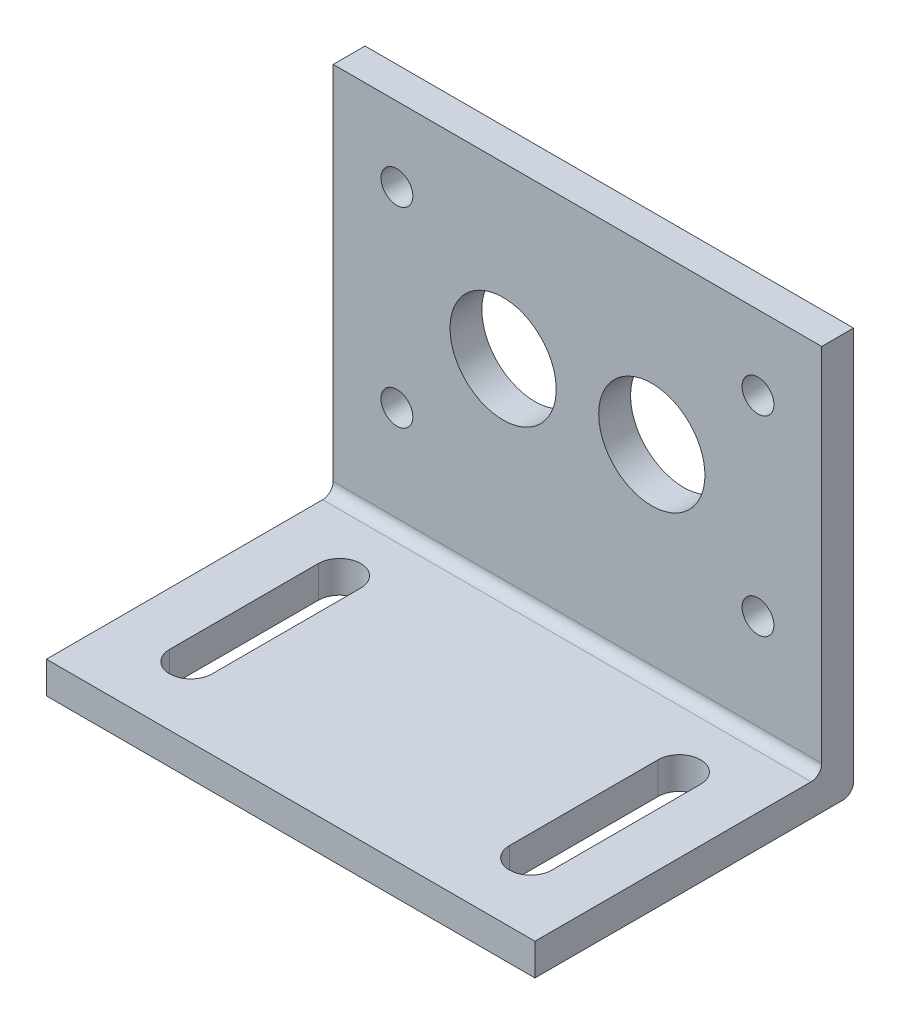
ISO-10303-21;
HEADER;
FILE_DESCRIPTION(('STEP AP214'),'2;1');
FILE_NAME('part.step','',(''),(''),'','','');
FILE_SCHEMA(('AUTOMOTIVE_DESIGN { 1 0 10303 214 1 1 1 1 }'));
ENDSEC;
DATA;
#1=APPLICATION_CONTEXT('core data for automotive mechanical design processes');
#2=APPLICATION_PROTOCOL_DEFINITION('international standard','automotive_design',2000,#1);
#3=PRODUCT_CONTEXT('',#1,'mechanical');
#4=PRODUCT('Part','Part','',(#3));
#5=PRODUCT_RELATED_PRODUCT_CATEGORY('part','',(#4));
#6=PRODUCT_DEFINITION_FORMATION('','',#4);
#7=PRODUCT_DEFINITION_CONTEXT('part definition',#1,'design');
#8=PRODUCT_DEFINITION('design','',#6,#7);
#9=PRODUCT_DEFINITION_SHAPE('','',#8);
#10=(LENGTH_UNIT() NAMED_UNIT(*) SI_UNIT(.MILLI.,.METRE.));
#11=(NAMED_UNIT(*) PLANE_ANGLE_UNIT() SI_UNIT($,.RADIAN.));
#12=(NAMED_UNIT(*) SI_UNIT($,.STERADIAN.) SOLID_ANGLE_UNIT());
#13=UNCERTAINTY_MEASURE_WITH_UNIT(LENGTH_MEASURE(1.E-05),#10,'distance_accuracy_value','');
#14=(GEOMETRIC_REPRESENTATION_CONTEXT(3) GLOBAL_UNCERTAINTY_ASSIGNED_CONTEXT((#13)) GLOBAL_UNIT_ASSIGNED_CONTEXT((#10,
#11,#12)) REPRESENTATION_CONTEXT('',''));
#15=CARTESIAN_POINT('',(0.,0.,0.));
#16=DIRECTION('',(0.,0.,1.));
#17=DIRECTION('',(1.,0.,0.));
#18=AXIS2_PLACEMENT_3D('',#15,#16,#17);
#19=CARTESIAN_POINT('',(0.,3.,0.));
#20=DIRECTION('',(0.,-1.,0.));
#21=DIRECTION('',(0.,0.,-1.));
#22=AXIS2_PLACEMENT_3D('',#19,#20,#21);
#23=PLANE('',#22);
#24=DIRECTION('',(0.,0.,-1.));
#25=VECTOR('',#24,1.);
#26=CARTESIAN_POINT('',(-14.,3.,8.4));
#27=LINE('',#26,#25);
#28=CARTESIAN_POINT('',(-14.,3.,8.4));
#29=VERTEX_POINT('',#28);
#30=CARTESIAN_POINT('',(-14.,3.,-5.6));
#31=VERTEX_POINT('',#30);
#32=EDGE_CURVE('E183',#29,#31,#27,.T.);
#33=ORIENTED_EDGE('',*,*,#32,.F.);
#34=CARTESIAN_POINT('',(-16.,3.,8.4));
#35=DIRECTION('',(0.,1.,0.));
#36=DIRECTION('',(0.,0.,1.));
#37=AXIS2_PLACEMENT_3D('',#34,#35,#36);
#38=CIRCLE('',#37,2.);
#39=CARTESIAN_POINT('',(-18.,3.,8.4));
#40=VERTEX_POINT('',#39);
#41=EDGE_CURVE('E56',#40,#29,#38,.T.);
#42=ORIENTED_EDGE('',*,*,#41,.F.);
#43=DIRECTION('',(0.,0.,1.));
#44=VECTOR('',#43,1.);
#45=CARTESIAN_POINT('',(-18.,3.,8.4));
#46=LINE('',#45,#44);
#47=CARTESIAN_POINT('',(-18.,3.,-5.6));
#48=VERTEX_POINT('',#47);
#49=EDGE_CURVE('E174',#48,#40,#46,.T.);
#50=ORIENTED_EDGE('',*,*,#49,.F.);
#51=CARTESIAN_POINT('',(-16.,3.,-5.6));
#52=DIRECTION('',(0.,1.,0.));
#53=DIRECTION('',(0.,0.,1.));
#54=AXIS2_PLACEMENT_3D('',#51,#52,#53);
#55=CIRCLE('',#54,2.);
#56=EDGE_CURVE('E177',#31,#48,#55,.T.);
#57=ORIENTED_EDGE('',*,*,#56,.F.);
#58=EDGE_LOOP('',(#33,#42,#50,#57));
#59=FACE_BOUND('',#58,.T.);
#60=DIRECTION('',(0.,0.,-1.));
#61=VECTOR('',#60,1.);
#62=CARTESIAN_POINT('',(18.,3.,8.4));
#63=LINE('',#62,#61);
#64=CARTESIAN_POINT('',(18.,3.,8.4));
#65=VERTEX_POINT('',#64);
#66=CARTESIAN_POINT('',(18.,3.,-5.6));
#67=VERTEX_POINT('',#66);
#68=EDGE_CURVE('E209',#65,#67,#63,.T.);
#69=ORIENTED_EDGE('',*,*,#68,.F.);
#70=CARTESIAN_POINT('',(16.,3.,8.4));
#71=DIRECTION('',(0.,1.,0.));
#72=DIRECTION('',(0.,0.,-1.));
#73=AXIS2_PLACEMENT_3D('',#70,#71,#72);
#74=CIRCLE('',#73,2.);
#75=CARTESIAN_POINT('',(14.,3.,8.4));
#76=VERTEX_POINT('',#75);
#77=EDGE_CURVE('E64',#76,#65,#74,.T.);
#78=ORIENTED_EDGE('',*,*,#77,.F.);
#79=DIRECTION('',(0.,0.,1.));
#80=VECTOR('',#79,1.);
#81=CARTESIAN_POINT('',(14.,3.,8.4));
#82=LINE('',#81,#80);
#83=CARTESIAN_POINT('',(14.,3.,-5.6));
#84=VERTEX_POINT('',#83);
#85=EDGE_CURVE('E202',#84,#76,#82,.T.);
#86=ORIENTED_EDGE('',*,*,#85,.F.);
#87=CARTESIAN_POINT('',(16.,3.,-5.6));
#88=DIRECTION('',(0.,1.,0.));
#89=DIRECTION('',(0.,0.,-1.));
#90=AXIS2_PLACEMENT_3D('',#87,#88,#89);
#91=CIRCLE('',#90,2.);
#92=EDGE_CURVE('E205',#67,#84,#91,.T.);
#93=ORIENTED_EDGE('',*,*,#92,.F.);
#94=EDGE_LOOP('',(#69,#78,#86,#93));
#95=FACE_BOUND('',#94,.T.);
#96=DIRECTION('',(0.,0.,-1.));
#97=VECTOR('',#96,1.);
#98=CARTESIAN_POINT('',(23.,3.,15.));
#99=LINE('',#98,#97);
#100=CARTESIAN_POINT('',(23.,3.,15.));
#101=VERTEX_POINT('',#100);
#102=CARTESIAN_POINT('',(23.,3.,-11.));
#103=VERTEX_POINT('',#102);
#104=EDGE_CURVE('E276',#101,#103,#99,.T.);
#105=ORIENTED_EDGE('',*,*,#104,.T.);
#106=DIRECTION('',(1.,0.,0.));
#107=VECTOR('',#106,1.);
#108=CARTESIAN_POINT('',(-23.,3.,-11.));
#109=LINE('',#108,#107);
#110=CARTESIAN_POINT('',(-23.,3.,-11.));
#111=VERTEX_POINT('',#110);
#112=EDGE_CURVE('E313',#103,#111,#109,.F.);
#113=ORIENTED_EDGE('',*,*,#112,.T.);
#114=DIRECTION('',(0.,0.,1.));
#115=VECTOR('',#114,1.);
#116=CARTESIAN_POINT('',(-23.,3.,15.));
#117=LINE('',#116,#115);
#118=CARTESIAN_POINT('',(-23.,3.,15.));
#119=VERTEX_POINT('',#118);
#120=EDGE_CURVE('E279',#111,#119,#117,.T.);
#121=ORIENTED_EDGE('',*,*,#120,.T.);
#122=DIRECTION('',(1.,0.,0.));
#123=VECTOR('',#122,1.);
#124=CARTESIAN_POINT('',(-23.,3.,15.));
#125=LINE('',#124,#123);
#126=EDGE_CURVE('E282',#119,#101,#125,.T.);
#127=ORIENTED_EDGE('',*,*,#126,.T.);
#128=EDGE_LOOP('',(#105,#113,#121,#127));
#129=FACE_BOUND('',#128,.T.);
#130=ADVANCED_FACE('F41',(#59,#95,#129),#23,.F.);
#131=CARTESIAN_POINT('',(23.,3.,15.));
#132=DIRECTION('',(-1.,0.,0.));
#133=DIRECTION('',(0.,0.,1.));
#134=AXIS2_PLACEMENT_3D('',#131,#132,#133);
#135=PLANE('',#134);
#136=DIRECTION('',(0.,0.,-1.));
#137=VECTOR('',#136,1.);
#138=CARTESIAN_POINT('',(23.,0.,15.));
#139=LINE('',#138,#137);
#140=CARTESIAN_POINT('',(23.,0.,15.));
#141=VERTEX_POINT('',#140);
#142=CARTESIAN_POINT('',(23.,0.,-14.));
#143=VERTEX_POINT('',#142);
#144=EDGE_CURVE('E273',#141,#143,#139,.T.);
#145=ORIENTED_EDGE('',*,*,#144,.T.);
#146=CARTESIAN_POINT('',(23.,1.,-14.));
#147=DIRECTION('',(-1.,0.,0.));
#148=DIRECTION('',(0.,0.,1.));
#149=AXIS2_PLACEMENT_3D('',#146,#147,#148);
#150=CIRCLE('',#149,1.);
#151=CARTESIAN_POINT('',(23.,1.,-15.));
#152=VERTEX_POINT('',#151);
#153=EDGE_CURVE('E308',#143,#152,#150,.F.);
#154=ORIENTED_EDGE('',*,*,#153,.T.);
#155=DIRECTION('',(0.,-1.,0.));
#156=VECTOR('',#155,1.);
#157=CARTESIAN_POINT('',(23.,3.,-15.));
#158=LINE('',#157,#156);
#159=CARTESIAN_POINT('',(23.,38.,-15.));
#160=VERTEX_POINT('',#159);
#161=EDGE_CURVE('E298',#160,#152,#158,.T.);
#162=ORIENTED_EDGE('',*,*,#161,.F.);
#163=DIRECTION('',(0.,0.,-1.));
#164=VECTOR('',#163,1.);
#165=CARTESIAN_POINT('',(23.,38.,-12.));
#166=LINE('',#165,#164);
#167=CARTESIAN_POINT('',(23.,38.,-12.));
#168=VERTEX_POINT('',#167);
#169=EDGE_CURVE('E270',#168,#160,#166,.T.);
#170=ORIENTED_EDGE('',*,*,#169,.F.);
#171=DIRECTION('',(0.,-1.,0.));
#172=VECTOR('',#171,1.);
#173=CARTESIAN_POINT('',(23.,38.,-12.));
#174=LINE('',#173,#172);
#175=CARTESIAN_POINT('',(23.,4.,-12.));
#176=VERTEX_POINT('',#175);
#177=EDGE_CURVE('E264',#168,#176,#174,.T.);
#178=ORIENTED_EDGE('',*,*,#177,.T.);
#179=CARTESIAN_POINT('',(23.,4.,-11.));
#180=DIRECTION('',(-1.,0.,0.));
#181=DIRECTION('',(0.,0.,1.));
#182=AXIS2_PLACEMENT_3D('',#179,#180,#181);
#183=CIRCLE('',#182,1.);
#184=EDGE_CURVE('E49',#176,#103,#183,.T.);
#185=ORIENTED_EDGE('',*,*,#184,.T.);
#186=ORIENTED_EDGE('',*,*,#104,.F.);
#187=DIRECTION('',(0.,-1.,0.));
#188=VECTOR('',#187,1.);
#189=CARTESIAN_POINT('',(23.,3.,15.));
#190=LINE('',#189,#188);
#191=EDGE_CURVE('E284',#101,#141,#190,.T.);
#192=ORIENTED_EDGE('',*,*,#191,.T.);
#193=EDGE_LOOP('',(#145,#154,#162,#170,#178,#185,#186,#192));
#194=FACE_BOUND('',#193,.T.);
#195=ADVANCED_FACE('F316',(#194),#135,.F.);
#196=CARTESIAN_POINT('',(-23.,3.,-15.));
#197=DIRECTION('',(0.,0.,1.));
#198=DIRECTION('',(1.,0.,0.));
#199=AXIS2_PLACEMENT_3D('',#196,#197,#198);
#200=PLANE('',#199);
#201=CARTESIAN_POINT('',(-7.,22.,-15.));
#202=DIRECTION('',(0.,0.,-1.));
#203=DIRECTION('',(-1.,0.,0.));
#204=AXIS2_PLACEMENT_3D('',#201,#202,#203);
#205=CIRCLE('',#204,5.);
#206=CARTESIAN_POINT('',(-12.,22.,-15.));
#207=VERTEX_POINT('',#206);
#208=EDGE_CURVE('E236',#207,#207,#205,.T.);
#209=ORIENTED_EDGE('',*,*,#208,.F.);
#210=EDGE_LOOP('',(#209));
#211=FACE_BOUND('',#210,.T.);
#212=CARTESIAN_POINT('',(17.,13.,-15.));
#213=DIRECTION('',(0.,0.,-1.));
#214=DIRECTION('',(-1.,0.,0.));
#215=AXIS2_PLACEMENT_3D('',#212,#213,#214);
#216=CIRCLE('',#215,1.5);
#217=CARTESIAN_POINT('',(15.5,13.,-15.));
#218=VERTEX_POINT('',#217);
#219=EDGE_CURVE('E229',#218,#218,#216,.T.);
#220=ORIENTED_EDGE('',*,*,#219,.F.);
#221=EDGE_LOOP('',(#220));
#222=FACE_BOUND('',#221,.T.);
#223=CARTESIAN_POINT('',(17.,31.,-15.));
#224=DIRECTION('',(0.,0.,-1.));
#225=DIRECTION('',(-1.,0.,0.));
#226=AXIS2_PLACEMENT_3D('',#223,#224,#225);
#227=CIRCLE('',#226,1.5);
#228=CARTESIAN_POINT('',(15.5,31.,-15.));
#229=VERTEX_POINT('',#228);
#230=EDGE_CURVE('E248',#229,#229,#227,.T.);
#231=ORIENTED_EDGE('',*,*,#230,.F.);
#232=EDGE_LOOP('',(#231));
#233=FACE_BOUND('',#232,.T.);
#234=CARTESIAN_POINT('',(-17.,13.,-15.));
#235=DIRECTION('',(0.,0.,-1.));
#236=DIRECTION('',(-1.,0.,0.));
#237=AXIS2_PLACEMENT_3D('',#234,#235,#236);
#238=CIRCLE('',#237,1.5);
#239=CARTESIAN_POINT('',(-18.5,13.,-15.));
#240=VERTEX_POINT('',#239);
#241=EDGE_CURVE('E241',#240,#240,#238,.T.);
#242=ORIENTED_EDGE('',*,*,#241,.F.);
#243=EDGE_LOOP('',(#242));
#244=FACE_BOUND('',#243,.T.);
#245=CARTESIAN_POINT('',(7.,22.,-15.));
#246=DIRECTION('',(0.,0.,-1.));
#247=DIRECTION('',(-1.,0.,0.));
#248=AXIS2_PLACEMENT_3D('',#245,#246,#247);
#249=CIRCLE('',#248,5.);
#250=CARTESIAN_POINT('',(2.,22.,-15.));
#251=VERTEX_POINT('',#250);
#252=EDGE_CURVE('E223',#251,#251,#249,.T.);
#253=ORIENTED_EDGE('',*,*,#252,.F.);
#254=EDGE_LOOP('',(#253));
#255=FACE_BOUND('',#254,.T.);
#256=CARTESIAN_POINT('',(-17.,31.,-15.));
#257=DIRECTION('',(0.,0.,-1.));
#258=DIRECTION('',(-1.,0.,0.));
#259=AXIS2_PLACEMENT_3D('',#256,#257,#258);
#260=CIRCLE('',#259,1.5);
#261=CARTESIAN_POINT('',(-18.5,31.,-15.));
#262=VERTEX_POINT('',#261);
#263=EDGE_CURVE('E244',#262,#262,#260,.T.);
#264=ORIENTED_EDGE('',*,*,#263,.F.);
#265=EDGE_LOOP('',(#264));
#266=FACE_BOUND('',#265,.T.);
#267=ORIENTED_EDGE('',*,*,#161,.T.);
#268=DIRECTION('',(-1.,0.,0.));
#269=VECTOR('',#268,1.);
#270=CARTESIAN_POINT('',(-23.,1.,-15.));
#271=LINE('',#270,#269);
#272=CARTESIAN_POINT('',(-23.,1.,-15.));
#273=VERTEX_POINT('',#272);
#274=EDGE_CURVE('E301',#152,#273,#271,.T.);
#275=ORIENTED_EDGE('',*,*,#274,.T.);
#276=DIRECTION('',(0.,-1.,0.));
#277=VECTOR('',#276,1.);
#278=CARTESIAN_POINT('',(-23.,3.,-15.));
#279=LINE('',#278,#277);
#280=CARTESIAN_POINT('',(-23.,38.,-15.));
#281=VERTEX_POINT('',#280);
#282=EDGE_CURVE('E295',#281,#273,#279,.T.);
#283=ORIENTED_EDGE('',*,*,#282,.F.);
#284=DIRECTION('',(1.,0.,0.));
#285=VECTOR('',#284,1.);
#286=CARTESIAN_POINT('',(23.,38.,-15.));
#287=LINE('',#286,#285);
#288=EDGE_CURVE('E256',#281,#160,#287,.T.);
#289=ORIENTED_EDGE('',*,*,#288,.T.);
#290=EDGE_LOOP('',(#267,#275,#283,#289));
#291=FACE_BOUND('',#290,.T.);
#292=ADVANCED_FACE('F339',(#211,#222,#233,#244,#255,#266,#291),#200,.F.);
#293=CARTESIAN_POINT('',(-23.,3.,15.));
#294=DIRECTION('',(1.,0.,0.));
#295=DIRECTION('',(0.,0.,-1.));
#296=AXIS2_PLACEMENT_3D('',#293,#294,#295);
#297=PLANE('',#296);
#298=ORIENTED_EDGE('',*,*,#282,.T.);
#299=CARTESIAN_POINT('',(-23.,1.,-14.));
#300=DIRECTION('',(1.,0.,0.));
#301=DIRECTION('',(0.,0.,-1.));
#302=AXIS2_PLACEMENT_3D('',#299,#300,#301);
#303=CIRCLE('',#302,1.);
#304=CARTESIAN_POINT('',(-23.,0.,-14.));
#305=VERTEX_POINT('',#304);
#306=EDGE_CURVE('E304',#273,#305,#303,.F.);
#307=ORIENTED_EDGE('',*,*,#306,.T.);
#308=DIRECTION('',(0.,0.,1.));
#309=VECTOR('',#308,1.);
#310=CARTESIAN_POINT('',(-23.,0.,15.));
#311=LINE('',#310,#309);
#312=CARTESIAN_POINT('',(-23.,0.,15.));
#313=VERTEX_POINT('',#312);
#314=EDGE_CURVE('E287',#305,#313,#311,.T.);
#315=ORIENTED_EDGE('',*,*,#314,.T.);
#316=DIRECTION('',(0.,-1.,0.));
#317=VECTOR('',#316,1.);
#318=CARTESIAN_POINT('',(-23.,3.,15.));
#319=LINE('',#318,#317);
#320=EDGE_CURVE('E292',#119,#313,#319,.T.);
#321=ORIENTED_EDGE('',*,*,#320,.F.);
#322=ORIENTED_EDGE('',*,*,#120,.F.);
#323=CARTESIAN_POINT('',(-23.,4.,-11.));
#324=DIRECTION('',(1.,0.,0.));
#325=DIRECTION('',(0.,0.,-1.));
#326=AXIS2_PLACEMENT_3D('',#323,#324,#325);
#327=CIRCLE('',#326,1.);
#328=CARTESIAN_POINT('',(-23.,4.,-12.));
#329=VERTEX_POINT('',#328);
#330=EDGE_CURVE('E11',#111,#329,#327,.T.);
#331=ORIENTED_EDGE('',*,*,#330,.T.);
#332=DIRECTION('',(0.,1.,0.));
#333=VECTOR('',#332,1.);
#334=CARTESIAN_POINT('',(-23.,38.,-12.));
#335=LINE('',#334,#333);
#336=CARTESIAN_POINT('',(-23.,38.,-12.));
#337=VERTEX_POINT('',#336);
#338=EDGE_CURVE('E259',#329,#337,#335,.T.);
#339=ORIENTED_EDGE('',*,*,#338,.T.);
#340=DIRECTION('',(0.,0.,-1.));
#341=VECTOR('',#340,1.);
#342=CARTESIAN_POINT('',(-23.,38.,-12.));
#343=LINE('',#342,#341);
#344=EDGE_CURVE('E267',#337,#281,#343,.T.);
#345=ORIENTED_EDGE('',*,*,#344,.T.);
#346=EDGE_LOOP('',(#298,#307,#315,#321,#322,#331,#339,#345));
#347=FACE_BOUND('',#346,.T.);
#348=ADVANCED_FACE('F328',(#347),#297,.F.);
#349=CARTESIAN_POINT('',(-23.,3.,15.));
#350=DIRECTION('',(0.,0.,-1.));
#351=DIRECTION('',(-1.,0.,0.));
#352=AXIS2_PLACEMENT_3D('',#349,#350,#351);
#353=PLANE('',#352);
#354=DIRECTION('',(1.,0.,0.));
#355=VECTOR('',#354,1.);
#356=CARTESIAN_POINT('',(-23.,0.,15.));
#357=LINE('',#356,#355);
#358=EDGE_CURVE('E280',#313,#141,#357,.T.);
#359=ORIENTED_EDGE('',*,*,#358,.T.);
#360=ORIENTED_EDGE('',*,*,#191,.F.);
#361=ORIENTED_EDGE('',*,*,#126,.F.);
#362=ORIENTED_EDGE('',*,*,#320,.T.);
#363=EDGE_LOOP('',(#359,#360,#361,#362));
#364=FACE_BOUND('',#363,.T.);
#365=ADVANCED_FACE('F349',(#364),#353,.F.);
#366=CARTESIAN_POINT('',(0.,0.,0.));
#367=DIRECTION('',(0.,-1.,0.));
#368=DIRECTION('',(0.,0.,-1.));
#369=AXIS2_PLACEMENT_3D('',#366,#367,#368);
#370=PLANE('',#369);
#371=CARTESIAN_POINT('',(-16.,0.,8.4));
#372=DIRECTION('',(0.,1.,0.));
#373=DIRECTION('',(0.,0.,1.));
#374=AXIS2_PLACEMENT_3D('',#371,#372,#373);
#375=CIRCLE('',#374,2.);
#376=CARTESIAN_POINT('',(-18.,0.,8.4));
#377=VERTEX_POINT('',#376);
#378=CARTESIAN_POINT('',(-14.,0.,8.4));
#379=VERTEX_POINT('',#378);
#380=EDGE_CURVE('E155',#377,#379,#375,.T.);
#381=ORIENTED_EDGE('',*,*,#380,.T.);
#382=DIRECTION('',(0.,0.,-1.));
#383=VECTOR('',#382,1.);
#384=CARTESIAN_POINT('',(-14.,0.,8.4));
#385=LINE('',#384,#383);
#386=CARTESIAN_POINT('',(-14.,0.,-5.6));
#387=VERTEX_POINT('',#386);
#388=EDGE_CURVE('E165',#379,#387,#385,.T.);
#389=ORIENTED_EDGE('',*,*,#388,.T.);
#390=CARTESIAN_POINT('',(-16.,0.,-5.6));
#391=DIRECTION('',(0.,1.,0.));
#392=DIRECTION('',(0.,0.,1.));
#393=AXIS2_PLACEMENT_3D('',#390,#391,#392);
#394=CIRCLE('',#393,2.);
#395=CARTESIAN_POINT('',(-18.,0.,-5.6));
#396=VERTEX_POINT('',#395);
#397=EDGE_CURVE('E169',#387,#396,#394,.T.);
#398=ORIENTED_EDGE('',*,*,#397,.T.);
#399=DIRECTION('',(0.,0.,1.));
#400=VECTOR('',#399,1.);
#401=CARTESIAN_POINT('',(-18.,0.,8.4));
#402=LINE('',#401,#400);
#403=EDGE_CURVE('E161',#396,#377,#402,.T.);
#404=ORIENTED_EDGE('',*,*,#403,.T.);
#405=EDGE_LOOP('',(#381,#389,#398,#404));
#406=FACE_BOUND('',#405,.T.);
#407=CARTESIAN_POINT('',(16.,0.,8.4));
#408=DIRECTION('',(0.,1.,0.));
#409=DIRECTION('',(0.,0.,-1.));
#410=AXIS2_PLACEMENT_3D('',#407,#408,#409);
#411=CIRCLE('',#410,2.);
#412=CARTESIAN_POINT('',(14.,0.,8.4));
#413=VERTEX_POINT('',#412);
#414=CARTESIAN_POINT('',(18.,0.,8.4));
#415=VERTEX_POINT('',#414);
#416=EDGE_CURVE('E206',#413,#415,#411,.T.);
#417=ORIENTED_EDGE('',*,*,#416,.T.);
#418=DIRECTION('',(0.,0.,-1.));
#419=VECTOR('',#418,1.);
#420=CARTESIAN_POINT('',(18.,0.,8.4));
#421=LINE('',#420,#419);
#422=CARTESIAN_POINT('',(18.,0.,-5.6));
#423=VERTEX_POINT('',#422);
#424=EDGE_CURVE('E218',#415,#423,#421,.T.);
#425=ORIENTED_EDGE('',*,*,#424,.T.);
#426=CARTESIAN_POINT('',(16.,0.,-5.6));
#427=DIRECTION('',(0.,1.,0.));
#428=DIRECTION('',(0.,0.,-1.));
#429=AXIS2_PLACEMENT_3D('',#426,#427,#428);
#430=CIRCLE('',#429,2.);
#431=CARTESIAN_POINT('',(14.,0.,-5.6));
#432=VERTEX_POINT('',#431);
#433=EDGE_CURVE('E215',#423,#432,#430,.T.);
#434=ORIENTED_EDGE('',*,*,#433,.T.);
#435=DIRECTION('',(0.,0.,1.));
#436=VECTOR('',#435,1.);
#437=CARTESIAN_POINT('',(14.,0.,8.4));
#438=LINE('',#437,#436);
#439=EDGE_CURVE('E195',#432,#413,#438,.T.);
#440=ORIENTED_EDGE('',*,*,#439,.T.);
#441=EDGE_LOOP('',(#417,#425,#434,#440));
#442=FACE_BOUND('',#441,.T.);
#443=ORIENTED_EDGE('',*,*,#314,.F.);
#444=DIRECTION('',(-1.,0.,0.));
#445=VECTOR('',#444,1.);
#446=CARTESIAN_POINT('',(23.,0.,-14.));
#447=LINE('',#446,#445);
#448=EDGE_CURVE('E306',#305,#143,#447,.F.);
#449=ORIENTED_EDGE('',*,*,#448,.T.);
#450=ORIENTED_EDGE('',*,*,#144,.F.);
#451=ORIENTED_EDGE('',*,*,#358,.F.);
#452=EDGE_LOOP('',(#443,#449,#450,#451));
#453=FACE_BOUND('',#452,.T.);
#454=ADVANCED_FACE('F171',(#406,#442,#453),#370,.T.);
#455=CARTESIAN_POINT('',(0.,0.,-12.));
#456=DIRECTION('',(0.,0.,-1.));
#457=DIRECTION('',(-1.,0.,0.));
#458=AXIS2_PLACEMENT_3D('',#455,#456,#457);
#459=PLANE('',#458);
#460=CARTESIAN_POINT('',(-7.,22.,-12.));
#461=DIRECTION('',(0.,0.,-1.));
#462=DIRECTION('',(-1.,0.,0.));
#463=AXIS2_PLACEMENT_3D('',#460,#461,#462);
#464=CIRCLE('',#463,5.);
#465=CARTESIAN_POINT('',(-12.,22.,-12.));
#466=VERTEX_POINT('',#465);
#467=EDGE_CURVE('E226',#466,#466,#464,.T.);
#468=ORIENTED_EDGE('',*,*,#467,.T.);
#469=EDGE_LOOP('',(#468));
#470=FACE_BOUND('',#469,.T.);
#471=CARTESIAN_POINT('',(17.,13.,-12.));
#472=DIRECTION('',(0.,0.,-1.));
#473=DIRECTION('',(-1.,0.,0.));
#474=AXIS2_PLACEMENT_3D('',#471,#472,#473);
#475=CIRCLE('',#474,1.5);
#476=CARTESIAN_POINT('',(15.5,13.,-12.));
#477=VERTEX_POINT('',#476);
#478=EDGE_CURVE('E233',#477,#477,#475,.T.);
#479=ORIENTED_EDGE('',*,*,#478,.T.);
#480=EDGE_LOOP('',(#479));
#481=FACE_BOUND('',#480,.T.);
#482=CARTESIAN_POINT('',(17.,31.,-12.));
#483=DIRECTION('',(0.,0.,-1.));
#484=DIRECTION('',(-1.,0.,0.));
#485=AXIS2_PLACEMENT_3D('',#482,#483,#484);
#486=CIRCLE('',#485,1.5);
#487=CARTESIAN_POINT('',(15.5,31.,-12.));
#488=VERTEX_POINT('',#487);
#489=EDGE_CURVE('E232',#488,#488,#486,.T.);
#490=ORIENTED_EDGE('',*,*,#489,.T.);
#491=EDGE_LOOP('',(#490));
#492=FACE_BOUND('',#491,.T.);
#493=CARTESIAN_POINT('',(-17.,13.,-12.));
#494=DIRECTION('',(0.,0.,-1.));
#495=DIRECTION('',(-1.,0.,0.));
#496=AXIS2_PLACEMENT_3D('',#493,#494,#495);
#497=CIRCLE('',#496,1.5);
#498=CARTESIAN_POINT('',(-18.5,13.,-12.));
#499=VERTEX_POINT('',#498);
#500=EDGE_CURVE('E245',#499,#499,#497,.T.);
#501=ORIENTED_EDGE('',*,*,#500,.T.);
#502=EDGE_LOOP('',(#501));
#503=FACE_BOUND('',#502,.T.);
#504=CARTESIAN_POINT('',(7.,22.,-12.));
#505=DIRECTION('',(0.,0.,-1.));
#506=DIRECTION('',(-1.,0.,0.));
#507=AXIS2_PLACEMENT_3D('',#504,#505,#506);
#508=CIRCLE('',#507,5.);
#509=CARTESIAN_POINT('',(2.,22.,-12.));
#510=VERTEX_POINT('',#509);
#511=EDGE_CURVE('E189',#510,#510,#508,.T.);
#512=ORIENTED_EDGE('',*,*,#511,.T.);
#513=EDGE_LOOP('',(#512));
#514=FACE_BOUND('',#513,.T.);
#515=CARTESIAN_POINT('',(-17.,31.,-12.));
#516=DIRECTION('',(0.,0.,-1.));
#517=DIRECTION('',(-1.,0.,0.));
#518=AXIS2_PLACEMENT_3D('',#515,#516,#517);
#519=CIRCLE('',#518,1.5);
#520=CARTESIAN_POINT('',(-18.5,31.,-12.));
#521=VERTEX_POINT('',#520);
#522=EDGE_CURVE('E253',#521,#521,#519,.T.);
#523=ORIENTED_EDGE('',*,*,#522,.T.);
#524=EDGE_LOOP('',(#523));
#525=FACE_BOUND('',#524,.T.);
#526=ORIENTED_EDGE('',*,*,#338,.F.);
#527=DIRECTION('',(1.,0.,0.));
#528=VECTOR('',#527,1.);
#529=CARTESIAN_POINT('',(23.,4.,-12.));
#530=LINE('',#529,#528);
#531=EDGE_CURVE('E310',#329,#176,#530,.T.);
#532=ORIENTED_EDGE('',*,*,#531,.T.);
#533=ORIENTED_EDGE('',*,*,#177,.F.);
#534=DIRECTION('',(1.,0.,0.));
#535=VECTOR('',#534,1.);
#536=CARTESIAN_POINT('',(23.,38.,-12.));
#537=LINE('',#536,#535);
#538=EDGE_CURVE('E261',#337,#168,#537,.T.);
#539=ORIENTED_EDGE('',*,*,#538,.F.);
#540=EDGE_LOOP('',(#526,#532,#533,#539));
#541=FACE_BOUND('',#540,.T.);
#542=ADVANCED_FACE('F333',(#470,#481,#492,#503,#514,#525,#541),#459,.F.);
#543=CARTESIAN_POINT('',(23.,38.,-12.));
#544=DIRECTION('',(0.,1.,0.));
#545=DIRECTION('',(0.,0.,1.));
#546=AXIS2_PLACEMENT_3D('',#543,#544,#545);
#547=PLANE('',#546);
#548=ORIENTED_EDGE('',*,*,#288,.F.);
#549=ORIENTED_EDGE('',*,*,#344,.F.);
#550=ORIENTED_EDGE('',*,*,#538,.T.);
#551=ORIENTED_EDGE('',*,*,#169,.T.);
#552=EDGE_LOOP('',(#548,#549,#550,#551));
#553=FACE_BOUND('',#552,.T.);
#554=ADVANCED_FACE('F336',(#553),#547,.T.);
#555=CARTESIAN_POINT('',(-23.,1.,-14.));
#556=DIRECTION('',(1.,0.,0.));
#557=DIRECTION('',(0.,0.,-1.));
#558=AXIS2_PLACEMENT_3D('',#555,#556,#557);
#559=CYLINDRICAL_SURFACE('',#558,1.);
#560=ORIENTED_EDGE('',*,*,#153,.F.);
#561=ORIENTED_EDGE('',*,*,#448,.F.);
#562=ORIENTED_EDGE('',*,*,#306,.F.);
#563=ORIENTED_EDGE('',*,*,#274,.F.);
#564=EDGE_LOOP('',(#560,#561,#562,#563));
#565=FACE_BOUND('',#564,.T.);
#566=ADVANCED_FACE('F343',(#565),#559,.T.);
#567=CARTESIAN_POINT('',(0.,4.,-11.));
#568=DIRECTION('',(-1.,0.,0.));
#569=DIRECTION('',(0.,0.,1.));
#570=AXIS2_PLACEMENT_3D('',#567,#568,#569);
#571=CYLINDRICAL_SURFACE('',#570,1.);
#572=ORIENTED_EDGE('',*,*,#330,.F.);
#573=ORIENTED_EDGE('',*,*,#112,.F.);
#574=ORIENTED_EDGE('',*,*,#184,.F.);
#575=ORIENTED_EDGE('',*,*,#531,.F.);
#576=EDGE_LOOP('',(#572,#573,#574,#575));
#577=FACE_BOUND('',#576,.T.);
#578=ADVANCED_FACE('F43',(#577),#571,.F.);
#579=CARTESIAN_POINT('',(-17.,31.,-12.));
#580=DIRECTION('',(0.,0.,-1.));
#581=DIRECTION('',(-1.,0.,0.));
#582=AXIS2_PLACEMENT_3D('',#579,#580,#581);
#583=CYLINDRICAL_SURFACE('',#582,1.5);
#584=ORIENTED_EDGE('',*,*,#522,.F.);
#585=EDGE_LOOP('',(#584));
#586=FACE_BOUND('',#585,.T.);
#587=ORIENTED_EDGE('',*,*,#263,.T.);
#588=EDGE_LOOP('',(#587));
#589=FACE_BOUND('',#588,.T.);
#590=ADVANCED_FACE('F373',(#586,#589),#583,.F.);
#591=CARTESIAN_POINT('',(7.,22.,-12.));
#592=DIRECTION('',(0.,0.,-1.));
#593=DIRECTION('',(-1.,0.,0.));
#594=AXIS2_PLACEMENT_3D('',#591,#592,#593);
#595=CYLINDRICAL_SURFACE('',#594,5.);
#596=ORIENTED_EDGE('',*,*,#511,.F.);
#597=EDGE_LOOP('',(#596));
#598=FACE_BOUND('',#597,.T.);
#599=ORIENTED_EDGE('',*,*,#252,.T.);
#600=EDGE_LOOP('',(#599));
#601=FACE_BOUND('',#600,.T.);
#602=ADVANCED_FACE('F376',(#598,#601),#595,.F.);
#603=CARTESIAN_POINT('',(-17.,13.,-12.));
#604=DIRECTION('',(0.,0.,-1.));
#605=DIRECTION('',(-1.,0.,0.));
#606=AXIS2_PLACEMENT_3D('',#603,#604,#605);
#607=CYLINDRICAL_SURFACE('',#606,1.5);
#608=ORIENTED_EDGE('',*,*,#500,.F.);
#609=EDGE_LOOP('',(#608));
#610=FACE_BOUND('',#609,.T.);
#611=ORIENTED_EDGE('',*,*,#241,.T.);
#612=EDGE_LOOP('',(#611));
#613=FACE_BOUND('',#612,.T.);
#614=ADVANCED_FACE('F382',(#610,#613),#607,.F.);
#615=CARTESIAN_POINT('',(17.,31.,-12.));
#616=DIRECTION('',(0.,0.,-1.));
#617=DIRECTION('',(-1.,0.,0.));
#618=AXIS2_PLACEMENT_3D('',#615,#616,#617);
#619=CYLINDRICAL_SURFACE('',#618,1.5);
#620=ORIENTED_EDGE('',*,*,#489,.F.);
#621=EDGE_LOOP('',(#620));
#622=FACE_BOUND('',#621,.T.);
#623=ORIENTED_EDGE('',*,*,#230,.T.);
#624=EDGE_LOOP('',(#623));
#625=FACE_BOUND('',#624,.T.);
#626=ADVANCED_FACE('F378',(#622,#625),#619,.F.);
#627=CARTESIAN_POINT('',(17.,13.,-12.));
#628=DIRECTION('',(0.,0.,-1.));
#629=DIRECTION('',(-1.,0.,0.));
#630=AXIS2_PLACEMENT_3D('',#627,#628,#629);
#631=CYLINDRICAL_SURFACE('',#630,1.5);
#632=ORIENTED_EDGE('',*,*,#478,.F.);
#633=EDGE_LOOP('',(#632));
#634=FACE_BOUND('',#633,.T.);
#635=ORIENTED_EDGE('',*,*,#219,.T.);
#636=EDGE_LOOP('',(#635));
#637=FACE_BOUND('',#636,.T.);
#638=ADVANCED_FACE('F381',(#634,#637),#631,.F.);
#639=CARTESIAN_POINT('',(-7.,22.,-12.));
#640=DIRECTION('',(0.,0.,-1.));
#641=DIRECTION('',(-1.,0.,0.));
#642=AXIS2_PLACEMENT_3D('',#639,#640,#641);
#643=CYLINDRICAL_SURFACE('',#642,5.);
#644=ORIENTED_EDGE('',*,*,#467,.F.);
#645=EDGE_LOOP('',(#644));
#646=FACE_BOUND('',#645,.T.);
#647=ORIENTED_EDGE('',*,*,#208,.T.);
#648=EDGE_LOOP('',(#647));
#649=FACE_BOUND('',#648,.T.);
#650=ADVANCED_FACE('F387',(#646,#649),#643,.F.);
#651=CARTESIAN_POINT('',(16.,0.,8.4));
#652=DIRECTION('',(0.,1.,0.));
#653=DIRECTION('',(0.,0.,1.));
#654=AXIS2_PLACEMENT_3D('',#651,#652,#653);
#655=CYLINDRICAL_SURFACE('',#654,2.);
#656=ORIENTED_EDGE('',*,*,#77,.T.);
#657=DIRECTION('',(0.,1.,0.));
#658=VECTOR('',#657,1.);
#659=CARTESIAN_POINT('',(18.,0.,8.4));
#660=LINE('',#659,#658);
#661=EDGE_CURVE('E193',#415,#65,#660,.T.);
#662=ORIENTED_EDGE('',*,*,#661,.F.);
#663=ORIENTED_EDGE('',*,*,#416,.F.);
#664=DIRECTION('',(0.,1.,0.));
#665=VECTOR('',#664,1.);
#666=CARTESIAN_POINT('',(14.,0.,8.4));
#667=LINE('',#666,#665);
#668=EDGE_CURVE('E200',#413,#76,#667,.T.);
#669=ORIENTED_EDGE('',*,*,#668,.T.);
#670=EDGE_LOOP('',(#656,#662,#663,#669));
#671=FACE_BOUND('',#670,.T.);
#672=ADVANCED_FACE('F389',(#671),#655,.F.);
#673=CARTESIAN_POINT('',(14.,0.,8.4));
#674=DIRECTION('',(-1.,0.,0.));
#675=DIRECTION('',(0.,0.,1.));
#676=AXIS2_PLACEMENT_3D('',#673,#674,#675);
#677=PLANE('',#676);
#678=ORIENTED_EDGE('',*,*,#85,.T.);
#679=ORIENTED_EDGE('',*,*,#668,.F.);
#680=ORIENTED_EDGE('',*,*,#439,.F.);
#681=DIRECTION('',(0.,1.,0.));
#682=VECTOR('',#681,1.);
#683=CARTESIAN_POINT('',(14.,0.,-5.6));
#684=LINE('',#683,#682);
#685=EDGE_CURVE('E198',#432,#84,#684,.T.);
#686=ORIENTED_EDGE('',*,*,#685,.T.);
#687=EDGE_LOOP('',(#678,#679,#680,#686));
#688=FACE_BOUND('',#687,.T.);
#689=ADVANCED_FACE('F397',(#688),#677,.F.);
#690=CARTESIAN_POINT('',(16.,0.,-5.6));
#691=DIRECTION('',(0.,1.,0.));
#692=DIRECTION('',(0.,0.,1.));
#693=AXIS2_PLACEMENT_3D('',#690,#691,#692);
#694=CYLINDRICAL_SURFACE('',#693,2.);
#695=ORIENTED_EDGE('',*,*,#92,.T.);
#696=ORIENTED_EDGE('',*,*,#685,.F.);
#697=ORIENTED_EDGE('',*,*,#433,.F.);
#698=DIRECTION('',(0.,1.,0.));
#699=VECTOR('',#698,1.);
#700=CARTESIAN_POINT('',(18.,0.,-5.6));
#701=LINE('',#700,#699);
#702=EDGE_CURVE('E196',#423,#67,#701,.T.);
#703=ORIENTED_EDGE('',*,*,#702,.T.);
#704=EDGE_LOOP('',(#695,#696,#697,#703));
#705=FACE_BOUND('',#704,.T.);
#706=ADVANCED_FACE('F400',(#705),#694,.F.);
#707=CARTESIAN_POINT('',(18.,0.,8.4));
#708=DIRECTION('',(1.,0.,0.));
#709=DIRECTION('',(0.,0.,-1.));
#710=AXIS2_PLACEMENT_3D('',#707,#708,#709);
#711=PLANE('',#710);
#712=ORIENTED_EDGE('',*,*,#68,.T.);
#713=ORIENTED_EDGE('',*,*,#702,.F.);
#714=ORIENTED_EDGE('',*,*,#424,.F.);
#715=ORIENTED_EDGE('',*,*,#661,.T.);
#716=EDGE_LOOP('',(#712,#713,#714,#715));
#717=FACE_BOUND('',#716,.T.);
#718=ADVANCED_FACE('F404',(#717),#711,.F.);
#719=CARTESIAN_POINT('',(-16.,0.,8.4));
#720=DIRECTION('',(0.,1.,0.));
#721=DIRECTION('',(0.,0.,1.));
#722=AXIS2_PLACEMENT_3D('',#719,#720,#721);
#723=CYLINDRICAL_SURFACE('',#722,2.);
#724=ORIENTED_EDGE('',*,*,#41,.T.);
#725=DIRECTION('',(0.,1.,0.));
#726=VECTOR('',#725,1.);
#727=CARTESIAN_POINT('',(-14.,0.,8.4));
#728=LINE('',#727,#726);
#729=EDGE_CURVE('E151',#379,#29,#728,.T.);
#730=ORIENTED_EDGE('',*,*,#729,.F.);
#731=ORIENTED_EDGE('',*,*,#380,.F.);
#732=DIRECTION('',(0.,1.,0.));
#733=VECTOR('',#732,1.);
#734=CARTESIAN_POINT('',(-18.,0.,8.4));
#735=LINE('',#734,#733);
#736=EDGE_CURVE('E187',#377,#40,#735,.T.);
#737=ORIENTED_EDGE('',*,*,#736,.T.);
#738=EDGE_LOOP('',(#724,#730,#731,#737));
#739=FACE_BOUND('',#738,.T.);
#740=ADVANCED_FACE('F153',(#739),#723,.F.);
#741=CARTESIAN_POINT('',(-18.,0.,8.4));
#742=DIRECTION('',(-1.,0.,0.));
#743=DIRECTION('',(0.,0.,1.));
#744=AXIS2_PLACEMENT_3D('',#741,#742,#743);
#745=PLANE('',#744);
#746=ORIENTED_EDGE('',*,*,#49,.T.);
#747=ORIENTED_EDGE('',*,*,#736,.F.);
#748=ORIENTED_EDGE('',*,*,#403,.F.);
#749=DIRECTION('',(0.,1.,0.));
#750=VECTOR('',#749,1.);
#751=CARTESIAN_POINT('',(-18.,0.,-5.6));
#752=LINE('',#751,#750);
#753=EDGE_CURVE('E190',#396,#48,#752,.T.);
#754=ORIENTED_EDGE('',*,*,#753,.T.);
#755=EDGE_LOOP('',(#746,#747,#748,#754));
#756=FACE_BOUND('',#755,.T.);
#757=ADVANCED_FACE('F413',(#756),#745,.F.);
#758=CARTESIAN_POINT('',(-16.,0.,-5.6));
#759=DIRECTION('',(0.,1.,0.));
#760=DIRECTION('',(0.,0.,1.));
#761=AXIS2_PLACEMENT_3D('',#758,#759,#760);
#762=CYLINDRICAL_SURFACE('',#761,2.);
#763=ORIENTED_EDGE('',*,*,#56,.T.);
#764=ORIENTED_EDGE('',*,*,#753,.F.);
#765=ORIENTED_EDGE('',*,*,#397,.F.);
#766=DIRECTION('',(0.,1.,0.));
#767=VECTOR('',#766,1.);
#768=CARTESIAN_POINT('',(-14.,0.,-5.6));
#769=LINE('',#768,#767);
#770=EDGE_CURVE('E160',#387,#31,#769,.T.);
#771=ORIENTED_EDGE('',*,*,#770,.T.);
#772=EDGE_LOOP('',(#763,#764,#765,#771));
#773=FACE_BOUND('',#772,.T.);
#774=ADVANCED_FACE('F416',(#773),#762,.F.);
#775=CARTESIAN_POINT('',(-14.,0.,8.4));
#776=DIRECTION('',(1.,0.,0.));
#777=DIRECTION('',(0.,0.,-1.));
#778=AXIS2_PLACEMENT_3D('',#775,#776,#777);
#779=PLANE('',#778);
#780=ORIENTED_EDGE('',*,*,#32,.T.);
#781=ORIENTED_EDGE('',*,*,#770,.F.);
#782=ORIENTED_EDGE('',*,*,#388,.F.);
#783=ORIENTED_EDGE('',*,*,#729,.T.);
#784=EDGE_LOOP('',(#780,#781,#782,#783));
#785=FACE_BOUND('',#784,.T.);
#786=ADVANCED_FACE('F166',(#785),#779,.F.);
#787=CLOSED_SHELL('',(#130,#195,#292,#348,#365,#454,#542,#554,#566,#578,#590,#602,#614,#626,
#638,#650,#672,#689,#706,#718,#740,#757,#774,#786));
#788=MANIFOLD_SOLID_BREP('B2',#787);
#789=ADVANCED_BREP_SHAPE_REPRESENTATION('',(#18,#788),#14);
#790=SHAPE_DEFINITION_REPRESENTATION(#9,#789);
ENDSEC;
END-ISO-10303-21;
